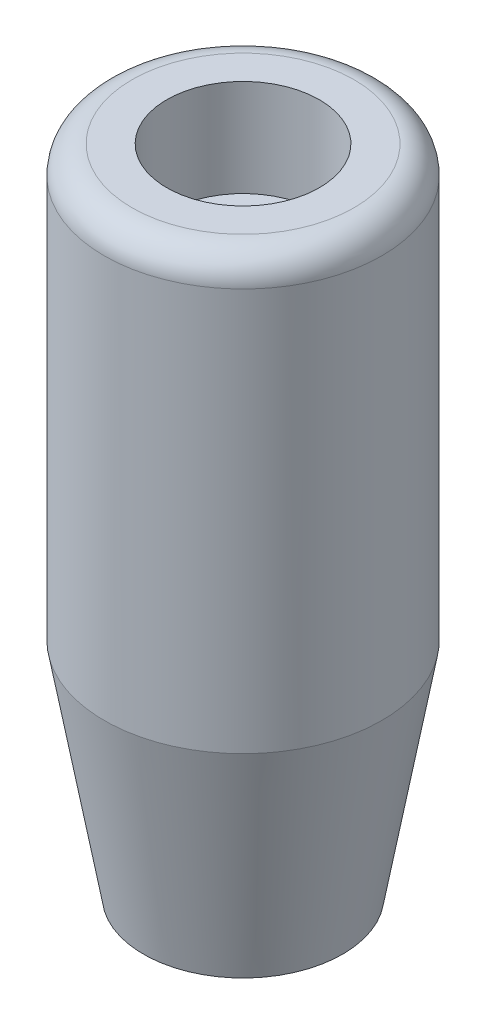
ISO-10303-21;
HEADER;
FILE_DESCRIPTION(('STEP AP214'),'2;1');
FILE_NAME('part.step','',(''),(''),'','','');
FILE_SCHEMA(('AUTOMOTIVE_DESIGN { 1 0 10303 214 1 1 1 1 }'));
ENDSEC;
DATA;
#1=APPLICATION_CONTEXT('core data for automotive mechanical design processes');
#2=APPLICATION_PROTOCOL_DEFINITION('international standard','automotive_design',2000,#1);
#3=PRODUCT_CONTEXT('',#1,'mechanical');
#4=PRODUCT('Part','Part','',(#3));
#5=PRODUCT_RELATED_PRODUCT_CATEGORY('part','',(#4));
#6=PRODUCT_DEFINITION_FORMATION('','',#4);
#7=PRODUCT_DEFINITION_CONTEXT('part definition',#1,'design');
#8=PRODUCT_DEFINITION('design','',#6,#7);
#9=PRODUCT_DEFINITION_SHAPE('','',#8);
#10=(LENGTH_UNIT() NAMED_UNIT(*) SI_UNIT(.MILLI.,.METRE.));
#11=(NAMED_UNIT(*) PLANE_ANGLE_UNIT() SI_UNIT($,.RADIAN.));
#12=(NAMED_UNIT(*) SI_UNIT($,.STERADIAN.) SOLID_ANGLE_UNIT());
#13=UNCERTAINTY_MEASURE_WITH_UNIT(LENGTH_MEASURE(1.E-05),#10,'distance_accuracy_value','');
#14=(GEOMETRIC_REPRESENTATION_CONTEXT(3) GLOBAL_UNCERTAINTY_ASSIGNED_CONTEXT((#13)) GLOBAL_UNIT_ASSIGNED_CONTEXT((#10,
#11,#12)) REPRESENTATION_CONTEXT('',''));
#15=CARTESIAN_POINT('',(0.,0.,0.));
#16=DIRECTION('',(0.,0.,1.));
#17=DIRECTION('',(1.,0.,0.));
#18=AXIS2_PLACEMENT_3D('',#15,#16,#17);
#19=CARTESIAN_POINT('',(7.17876830866463,0.,0.));
#20=DIRECTION('',(0.,-1.,0.));
#21=DIRECTION('',(0.,0.,-1.));
#22=AXIS2_PLACEMENT_3D('',#19,#20,#21);
#23=PLANE('',#22);
#24=CARTESIAN_POINT('',(0.,0.,0.));
#25=DIRECTION('',(0.,-1.,0.));
#26=DIRECTION('',(0.,0.,-1.));
#27=AXIS2_PLACEMENT_3D('',#24,#25,#26);
#28=CIRCLE('',#27,7.17876830866463);
#29=CARTESIAN_POINT('',(0.,0.,-7.17876830866463));
#30=VERTEX_POINT('',#29);
#31=EDGE_CURVE('E64',#30,#30,#28,.T.);
#32=ORIENTED_EDGE('',*,*,#31,.T.);
#33=EDGE_LOOP('',(#32));
#34=FACE_BOUND('',#33,.T.);
#35=CARTESIAN_POINT('',(0.,0.,0.));
#36=DIRECTION('',(0.,-1.,0.));
#37=DIRECTION('',(0.,0.,-1.));
#38=AXIS2_PLACEMENT_3D('',#35,#36,#37);
#39=CIRCLE('',#38,3.1);
#40=CARTESIAN_POINT('',(0.,0.,-3.1));
#41=VERTEX_POINT('',#40);
#42=EDGE_CURVE('E46',#41,#41,#39,.T.);
#43=ORIENTED_EDGE('',*,*,#42,.F.);
#44=EDGE_LOOP('',(#43));
#45=FACE_BOUND('',#44,.T.);
#46=ADVANCED_FACE('F35',(#34,#45),#23,.T.);
#47=CARTESIAN_POINT('',(0.,0.,0.));
#48=DIRECTION('',(0.,-1.,0.));
#49=DIRECTION('',(0.,0.,-1.));
#50=AXIS2_PLACEMENT_3D('',#47,#48,#49);
#51=CYLINDRICAL_SURFACE('',#50,3.1);
#52=ORIENTED_EDGE('',*,*,#42,.T.);
#53=EDGE_LOOP('',(#52));
#54=FACE_BOUND('',#53,.T.);
#55=CARTESIAN_POINT('',(0.,40.,0.));
#56=DIRECTION('',(0.,-1.,0.));
#57=DIRECTION('',(0.,0.,-1.));
#58=AXIS2_PLACEMENT_3D('',#55,#56,#57);
#59=CIRCLE('',#58,3.1);
#60=CARTESIAN_POINT('',(0.,40.,-3.1));
#61=VERTEX_POINT('',#60);
#62=EDGE_CURVE('E50',#61,#61,#59,.T.);
#63=ORIENTED_EDGE('',*,*,#62,.F.);
#64=EDGE_LOOP('',(#63));
#65=FACE_BOUND('',#64,.T.);
#66=ADVANCED_FACE('F83',(#54,#65),#51,.F.);
#67=CARTESIAN_POINT('',(3.1,40.,0.));
#68=DIRECTION('',(0.,1.,0.));
#69=DIRECTION('',(0.,0.,1.));
#70=AXIS2_PLACEMENT_3D('',#67,#68,#69);
#71=PLANE('',#70);
#72=ORIENTED_EDGE('',*,*,#62,.T.);
#73=EDGE_LOOP('',(#72));
#74=FACE_BOUND('',#73,.T.);
#75=CARTESIAN_POINT('',(0.,40.,0.));
#76=DIRECTION('',(0.,-1.,0.));
#77=DIRECTION('',(0.,0.,-1.));
#78=AXIS2_PLACEMENT_3D('',#75,#76,#77);
#79=CIRCLE('',#78,5.5);
#80=CARTESIAN_POINT('',(0.,40.,-5.5));
#81=VERTEX_POINT('',#80);
#82=EDGE_CURVE('E55',#81,#81,#79,.T.);
#83=ORIENTED_EDGE('',*,*,#82,.F.);
#84=EDGE_LOOP('',(#83));
#85=FACE_BOUND('',#84,.T.);
#86=ADVANCED_FACE('F87',(#74,#85),#71,.T.);
#87=CARTESIAN_POINT('',(0.,0.,0.));
#88=DIRECTION('',(0.,-1.,0.));
#89=DIRECTION('',(0.,0.,-1.));
#90=AXIS2_PLACEMENT_3D('',#87,#88,#89);
#91=CYLINDRICAL_SURFACE('',#90,5.5);
#92=ORIENTED_EDGE('',*,*,#82,.T.);
#93=EDGE_LOOP('',(#92));
#94=FACE_BOUND('',#93,.T.);
#95=CARTESIAN_POINT('',(0.,47.,0.));
#96=DIRECTION('',(0.,-1.,0.));
#97=DIRECTION('',(0.,0.,-1.));
#98=AXIS2_PLACEMENT_3D('',#95,#96,#97);
#99=CIRCLE('',#98,5.5);
#100=CARTESIAN_POINT('',(0.,47.,-5.5));
#101=VERTEX_POINT('',#100);
#102=EDGE_CURVE('E58',#101,#101,#99,.T.);
#103=ORIENTED_EDGE('',*,*,#102,.F.);
#104=EDGE_LOOP('',(#103));
#105=FACE_BOUND('',#104,.T.);
#106=ADVANCED_FACE('F93',(#94,#105),#91,.F.);
#107=CARTESIAN_POINT('',(5.5,47.,0.));
#108=DIRECTION('',(0.,1.,0.));
#109=DIRECTION('',(0.,0.,1.));
#110=AXIS2_PLACEMENT_3D('',#107,#108,#109);
#111=PLANE('',#110);
#112=CARTESIAN_POINT('',(0.,47.,0.));
#113=DIRECTION('',(0.,1.,0.));
#114=DIRECTION('',(0.,0.,1.));
#115=AXIS2_PLACEMENT_3D('',#112,#113,#114);
#116=CIRCLE('',#115,8.);
#117=CARTESIAN_POINT('',(0.,47.,8.));
#118=VERTEX_POINT('',#117);
#119=EDGE_CURVE('E10',#118,#118,#116,.T.);
#120=ORIENTED_EDGE('',*,*,#119,.T.);
#121=EDGE_LOOP('',(#120));
#122=FACE_BOUND('',#121,.T.);
#123=ORIENTED_EDGE('',*,*,#102,.T.);
#124=EDGE_LOOP('',(#123));
#125=FACE_BOUND('',#124,.T.);
#126=ADVANCED_FACE('F80',(#122,#125),#111,.T.);
#127=CARTESIAN_POINT('',(0.,0.,0.));
#128=DIRECTION('',(0.,-1.,0.));
#129=DIRECTION('',(0.,0.,-1.));
#130=AXIS2_PLACEMENT_3D('',#127,#128,#129);
#131=CYLINDRICAL_SURFACE('',#130,10.);
#132=CARTESIAN_POINT('',(0.,45.,0.));
#133=DIRECTION('',(0.,1.,0.));
#134=DIRECTION('',(0.,0.,1.));
#135=AXIS2_PLACEMENT_3D('',#132,#133,#134);
#136=CIRCLE('',#135,10.);
#137=CARTESIAN_POINT('',(0.,45.,10.));
#138=VERTEX_POINT('',#137);
#139=EDGE_CURVE('E42',#138,#138,#136,.F.);
#140=ORIENTED_EDGE('',*,*,#139,.T.);
#141=EDGE_LOOP('',(#140));
#142=FACE_BOUND('',#141,.T.);
#143=CARTESIAN_POINT('',(0.,16.,0.));
#144=DIRECTION('',(0.,-1.,0.));
#145=DIRECTION('',(0.,0.,-1.));
#146=AXIS2_PLACEMENT_3D('',#143,#144,#145);
#147=CIRCLE('',#146,10.);
#148=CARTESIAN_POINT('',(0.,16.,-10.));
#149=VERTEX_POINT('',#148);
#150=EDGE_CURVE('E61',#149,#149,#147,.T.);
#151=ORIENTED_EDGE('',*,*,#150,.F.);
#152=EDGE_LOOP('',(#151));
#153=FACE_BOUND('',#152,.T.);
#154=ADVANCED_FACE('F72',(#142,#153),#131,.T.);
#155=CARTESIAN_POINT('',(0.,0.,0.));
#156=DIRECTION('',(0.,1.,0.));
#157=DIRECTION('',(0.,0.,1.));
#158=AXIS2_PLACEMENT_3D('',#155,#156,#157);
#159=CONICAL_SURFACE('',#158,7.17876830866463,0.174532925199429);
#160=ORIENTED_EDGE('',*,*,#150,.T.);
#161=EDGE_LOOP('',(#160));
#162=FACE_BOUND('',#161,.T.);
#163=ORIENTED_EDGE('',*,*,#31,.F.);
#164=EDGE_LOOP('',(#163));
#165=FACE_BOUND('',#164,.T.);
#166=ADVANCED_FACE('F70',(#162,#165),#159,.T.);
#167=CARTESIAN_POINT('',(0.,45.,0.));
#168=DIRECTION('',(0.,1.,0.));
#169=DIRECTION('',(0.,0.,1.));
#170=AXIS2_PLACEMENT_3D('',#167,#168,#169);
#171=TOROIDAL_SURFACE('',#170,8.,2.);
#172=ORIENTED_EDGE('',*,*,#119,.F.);
#173=EDGE_LOOP('',(#172));
#174=FACE_BOUND('',#173,.T.);
#175=ORIENTED_EDGE('',*,*,#139,.F.);
#176=EDGE_LOOP('',(#175));
#177=FACE_BOUND('',#176,.T.);
#178=ADVANCED_FACE('F37',(#174,#177),#171,.T.);
#179=CLOSED_SHELL('',(#46,#66,#86,#106,#126,#154,#166,#178));
#180=MANIFOLD_SOLID_BREP('B2',#179);
#181=ADVANCED_BREP_SHAPE_REPRESENTATION('',(#18,#180),#14);
#182=SHAPE_DEFINITION_REPRESENTATION(#9,#181);
ENDSEC;
END-ISO-10303-21;
